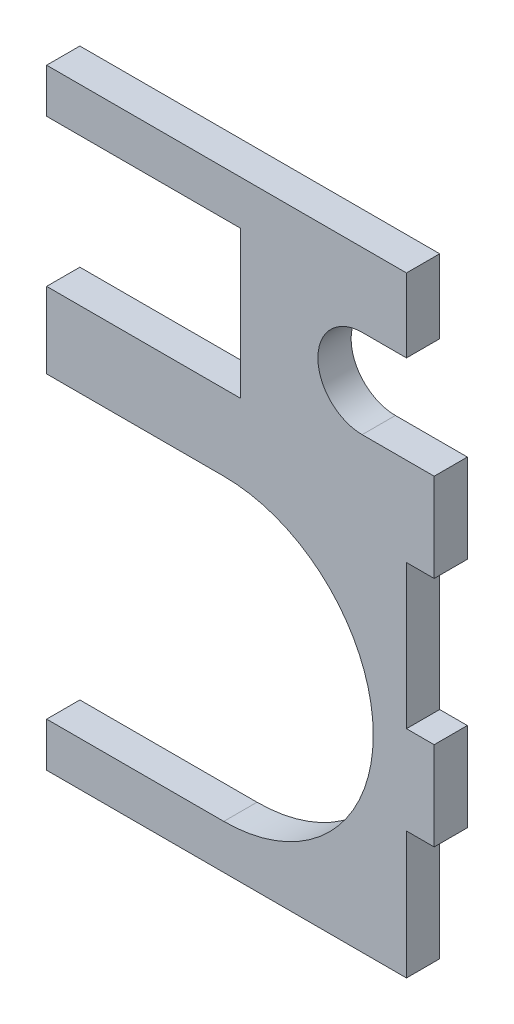
ISO-10303-21;
HEADER;
FILE_DESCRIPTION(('STEP AP214'),'2;1');
FILE_NAME('part.step','',(''),(''),'','','');
FILE_SCHEMA(('AUTOMOTIVE_DESIGN { 1 0 10303 214 1 1 1 1 }'));
ENDSEC;
DATA;
#1=APPLICATION_CONTEXT('core data for automotive mechanical design processes');
#2=APPLICATION_PROTOCOL_DEFINITION('international standard','automotive_design',2000,#1);
#3=PRODUCT_CONTEXT('',#1,'mechanical');
#4=PRODUCT('Part','Part','',(#3));
#5=PRODUCT_RELATED_PRODUCT_CATEGORY('part','',(#4));
#6=PRODUCT_DEFINITION_FORMATION('','',#4);
#7=PRODUCT_DEFINITION_CONTEXT('part definition',#1,'design');
#8=PRODUCT_DEFINITION('design','',#6,#7);
#9=PRODUCT_DEFINITION_SHAPE('','',#8);
#10=(LENGTH_UNIT() NAMED_UNIT(*) SI_UNIT(.MILLI.,.METRE.));
#11=(NAMED_UNIT(*) PLANE_ANGLE_UNIT() SI_UNIT($,.RADIAN.));
#12=(NAMED_UNIT(*) SI_UNIT($,.STERADIAN.) SOLID_ANGLE_UNIT());
#13=UNCERTAINTY_MEASURE_WITH_UNIT(LENGTH_MEASURE(1.E-05),#10,'distance_accuracy_value','');
#14=(GEOMETRIC_REPRESENTATION_CONTEXT(3) GLOBAL_UNCERTAINTY_ASSIGNED_CONTEXT((#13)) GLOBAL_UNIT_ASSIGNED_CONTEXT((#10,
#11,#12)) REPRESENTATION_CONTEXT('',''));
#15=CARTESIAN_POINT('',(0.,0.,0.));
#16=DIRECTION('',(0.,0.,1.));
#17=DIRECTION('',(1.,0.,0.));
#18=AXIS2_PLACEMENT_3D('',#15,#16,#17);
#19=CARTESIAN_POINT('',(12.5,26.9999999999999,3.));
#20=DIRECTION('',(0.,0.,-1.));
#21=DIRECTION('',(-1.,0.,0.));
#22=AXIS2_PLACEMENT_3D('',#19,#20,#21);
#23=CYLINDRICAL_SURFACE('',#22,4.);
#24=CARTESIAN_POINT('',(12.5,26.9999999999999,0.));
#25=DIRECTION('',(0.,0.,-1.));
#26=DIRECTION('',(1.,0.,0.));
#27=AXIS2_PLACEMENT_3D('',#24,#25,#26);
#28=CIRCLE('',#27,4.);
#29=CARTESIAN_POINT('',(12.5,22.9999999999999,0.));
#30=VERTEX_POINT('',#29);
#31=CARTESIAN_POINT('',(12.5,30.9999999999999,0.));
#32=VERTEX_POINT('',#31);
#33=EDGE_CURVE('E213',#30,#32,#28,.T.);
#34=ORIENTED_EDGE('',*,*,#33,.T.);
#35=DIRECTION('',(0.,0.,-1.));
#36=VECTOR('',#35,1.);
#37=CARTESIAN_POINT('',(12.5,30.9999999999999,3.));
#38=LINE('',#37,#36);
#39=CARTESIAN_POINT('',(12.5,30.9999999999999,3.));
#40=VERTEX_POINT('',#39);
#41=EDGE_CURVE('E11',#40,#32,#38,.T.);
#42=ORIENTED_EDGE('',*,*,#41,.F.);
#43=CARTESIAN_POINT('',(12.5,26.9999999999999,3.));
#44=DIRECTION('',(0.,0.,-1.));
#45=DIRECTION('',(1.,0.,0.));
#46=AXIS2_PLACEMENT_3D('',#43,#44,#45);
#47=CIRCLE('',#46,4.);
#48=CARTESIAN_POINT('',(12.5,22.9999999999999,3.));
#49=VERTEX_POINT('',#48);
#50=EDGE_CURVE('E255',#49,#40,#47,.T.);
#51=ORIENTED_EDGE('',*,*,#50,.F.);
#52=DIRECTION('',(0.,0.,-1.));
#53=VECTOR('',#52,1.);
#54=CARTESIAN_POINT('',(12.5,22.9999999999999,3.));
#55=LINE('',#54,#53);
#56=EDGE_CURVE('E209',#49,#30,#55,.T.);
#57=ORIENTED_EDGE('',*,*,#56,.T.);
#58=EDGE_LOOP('',(#34,#42,#51,#57));
#59=FACE_BOUND('',#58,.T.);
#60=ADVANCED_FACE('F33',(#59),#23,.F.);
#61=CARTESIAN_POINT('',(12.5,30.9999999999999,3.));
#62=DIRECTION('',(0.,1.,0.));
#63=DIRECTION('',(0.,0.,1.));
#64=AXIS2_PLACEMENT_3D('',#61,#62,#63);
#65=PLANE('',#64);
#66=DIRECTION('',(1.,0.,0.));
#67=VECTOR('',#66,1.);
#68=CARTESIAN_POINT('',(12.5,30.9999999999999,0.));
#69=LINE('',#68,#67);
#70=CARTESIAN_POINT('',(16.5,30.9999999999999,0.));
#71=VERTEX_POINT('',#70);
#72=EDGE_CURVE('E216',#32,#71,#69,.T.);
#73=ORIENTED_EDGE('',*,*,#72,.T.);
#74=DIRECTION('',(0.,0.,-1.));
#75=VECTOR('',#74,1.);
#76=CARTESIAN_POINT('',(16.5,30.9999999999999,3.));
#77=LINE('',#76,#75);
#78=CARTESIAN_POINT('',(16.5,30.9999999999999,3.));
#79=VERTEX_POINT('',#78);
#80=EDGE_CURVE('E41',#79,#71,#77,.T.);
#81=ORIENTED_EDGE('',*,*,#80,.F.);
#82=DIRECTION('',(1.,0.,0.));
#83=VECTOR('',#82,1.);
#84=CARTESIAN_POINT('',(12.5,30.9999999999999,3.));
#85=LINE('',#84,#83);
#86=EDGE_CURVE('E134',#40,#79,#85,.T.);
#87=ORIENTED_EDGE('',*,*,#86,.F.);
#88=ORIENTED_EDGE('',*,*,#41,.T.);
#89=EDGE_LOOP('',(#73,#81,#87,#88));
#90=FACE_BOUND('',#89,.T.);
#91=ADVANCED_FACE('F383',(#90),#65,.F.);
#92=CARTESIAN_POINT('',(16.5,30.9999999999999,3.));
#93=DIRECTION('',(-1.,0.,0.));
#94=DIRECTION('',(0.,-1.,0.));
#95=AXIS2_PLACEMENT_3D('',#92,#93,#94);
#96=PLANE('',#95);
#97=DIRECTION('',(0.,1.,0.));
#98=VECTOR('',#97,1.);
#99=CARTESIAN_POINT('',(16.5,30.9999999999999,0.));
#100=LINE('',#99,#98);
#101=CARTESIAN_POINT('',(16.5,37.6499999999998,0.));
#102=VERTEX_POINT('',#101);
#103=EDGE_CURVE('E218',#71,#102,#100,.T.);
#104=ORIENTED_EDGE('',*,*,#103,.T.);
#105=DIRECTION('',(0.,0.,-1.));
#106=VECTOR('',#105,1.);
#107=CARTESIAN_POINT('',(16.5,37.6499999999998,3.));
#108=LINE('',#107,#106);
#109=CARTESIAN_POINT('',(16.5,37.6499999999998,3.));
#110=VERTEX_POINT('',#109);
#111=EDGE_CURVE('E304',#110,#102,#108,.T.);
#112=ORIENTED_EDGE('',*,*,#111,.F.);
#113=DIRECTION('',(0.,1.,0.));
#114=VECTOR('',#113,1.);
#115=CARTESIAN_POINT('',(16.5,30.9999999999999,3.));
#116=LINE('',#115,#114);
#117=EDGE_CURVE('E312',#79,#110,#116,.T.);
#118=ORIENTED_EDGE('',*,*,#117,.F.);
#119=ORIENTED_EDGE('',*,*,#80,.T.);
#120=EDGE_LOOP('',(#104,#112,#118,#119));
#121=FACE_BOUND('',#120,.T.);
#122=ADVANCED_FACE('F310',(#121),#96,.F.);
#123=CARTESIAN_POINT('',(16.5,37.6499999999998,3.));
#124=DIRECTION('',(0.,-1.,0.));
#125=DIRECTION('',(1.,0.,0.));
#126=AXIS2_PLACEMENT_3D('',#123,#124,#125);
#127=PLANE('',#126);
#128=DIRECTION('',(-1.,0.,0.));
#129=VECTOR('',#128,1.);
#130=CARTESIAN_POINT('',(16.5,37.6499999999998,0.));
#131=LINE('',#130,#129);
#132=CARTESIAN_POINT('',(-16.,37.6499999999998,0.));
#133=VERTEX_POINT('',#132);
#134=EDGE_CURVE('E220',#102,#133,#131,.T.);
#135=ORIENTED_EDGE('',*,*,#134,.T.);
#136=DIRECTION('',(0.,0.,-1.));
#137=VECTOR('',#136,1.);
#138=CARTESIAN_POINT('',(-16.,37.6499999999998,3.));
#139=LINE('',#138,#137);
#140=CARTESIAN_POINT('',(-16.,37.6499999999998,3.));
#141=VERTEX_POINT('',#140);
#142=EDGE_CURVE('E301',#141,#133,#139,.T.);
#143=ORIENTED_EDGE('',*,*,#142,.F.);
#144=DIRECTION('',(-1.,0.,0.));
#145=VECTOR('',#144,1.);
#146=CARTESIAN_POINT('',(16.5,37.6499999999998,3.));
#147=LINE('',#146,#145);
#148=EDGE_CURVE('E330',#110,#141,#147,.T.);
#149=ORIENTED_EDGE('',*,*,#148,.F.);
#150=ORIENTED_EDGE('',*,*,#111,.T.);
#151=EDGE_LOOP('',(#135,#143,#149,#150));
#152=FACE_BOUND('',#151,.T.);
#153=ADVANCED_FACE('F321',(#152),#127,.F.);
#154=CARTESIAN_POINT('',(-16.,33.6499999999998,3.));
#155=DIRECTION('',(1.,0.,0.));
#156=DIRECTION('',(0.,1.,0.));
#157=AXIS2_PLACEMENT_3D('',#154,#155,#156);
#158=PLANE('',#157);
#159=DIRECTION('',(0.,-1.,0.));
#160=VECTOR('',#159,1.);
#161=CARTESIAN_POINT('',(-16.,33.6499999999998,0.));
#162=LINE('',#161,#160);
#163=CARTESIAN_POINT('',(-16.,33.6499999999998,0.));
#164=VERTEX_POINT('',#163);
#165=EDGE_CURVE('E222',#133,#164,#162,.T.);
#166=ORIENTED_EDGE('',*,*,#165,.T.);
#167=DIRECTION('',(0.,0.,-1.));
#168=VECTOR('',#167,1.);
#169=CARTESIAN_POINT('',(-16.,33.6499999999998,3.));
#170=LINE('',#169,#168);
#171=CARTESIAN_POINT('',(-16.,33.6499999999998,3.));
#172=VERTEX_POINT('',#171);
#173=EDGE_CURVE('E298',#172,#164,#170,.T.);
#174=ORIENTED_EDGE('',*,*,#173,.F.);
#175=DIRECTION('',(0.,-1.,0.));
#176=VECTOR('',#175,1.);
#177=CARTESIAN_POINT('',(-16.,33.6499999999998,3.));
#178=LINE('',#177,#176);
#179=EDGE_CURVE('E327',#141,#172,#178,.T.);
#180=ORIENTED_EDGE('',*,*,#179,.F.);
#181=ORIENTED_EDGE('',*,*,#142,.T.);
#182=EDGE_LOOP('',(#166,#174,#180,#181));
#183=FACE_BOUND('',#182,.T.);
#184=ADVANCED_FACE('F325',(#183),#158,.F.);
#185=CARTESIAN_POINT('',(-16.,33.6499999999998,3.));
#186=DIRECTION('',(0.,1.,0.));
#187=DIRECTION('',(0.,0.,1.));
#188=AXIS2_PLACEMENT_3D('',#185,#186,#187);
#189=PLANE('',#188);
#190=DIRECTION('',(1.,0.,0.));
#191=VECTOR('',#190,1.);
#192=CARTESIAN_POINT('',(-16.,33.6499999999998,0.));
#193=LINE('',#192,#191);
#194=CARTESIAN_POINT('',(1.50000000000321,33.6499999999998,0.));
#195=VERTEX_POINT('',#194);
#196=EDGE_CURVE('E224',#164,#195,#193,.T.);
#197=ORIENTED_EDGE('',*,*,#196,.T.);
#198=DIRECTION('',(0.,0.,-1.));
#199=VECTOR('',#198,1.);
#200=CARTESIAN_POINT('',(1.50000000000321,33.6499999999998,3.));
#201=LINE('',#200,#199);
#202=CARTESIAN_POINT('',(1.50000000000321,33.6499999999998,3.));
#203=VERTEX_POINT('',#202);
#204=EDGE_CURVE('E295',#203,#195,#201,.T.);
#205=ORIENTED_EDGE('',*,*,#204,.F.);
#206=DIRECTION('',(1.,0.,0.));
#207=VECTOR('',#206,1.);
#208=CARTESIAN_POINT('',(-16.,33.6499999999998,3.));
#209=LINE('',#208,#207);
#210=EDGE_CURVE('E329',#172,#203,#209,.T.);
#211=ORIENTED_EDGE('',*,*,#210,.F.);
#212=ORIENTED_EDGE('',*,*,#173,.T.);
#213=EDGE_LOOP('',(#197,#205,#211,#212));
#214=FACE_BOUND('',#213,.T.);
#215=ADVANCED_FACE('F396',(#214),#189,.F.);
#216=CARTESIAN_POINT('',(1.50000000000321,33.6499999999998,3.));
#217=DIRECTION('',(1.,0.,0.));
#218=DIRECTION('',(0.,1.,0.));
#219=AXIS2_PLACEMENT_3D('',#216,#217,#218);
#220=PLANE('',#219);
#221=DIRECTION('',(0.,-1.,0.));
#222=VECTOR('',#221,1.);
#223=CARTESIAN_POINT('',(1.50000000000321,33.6499999999998,0.));
#224=LINE('',#223,#222);
#225=CARTESIAN_POINT('',(1.50000000000322,20.35,0.));
#226=VERTEX_POINT('',#225);
#227=EDGE_CURVE('E226',#195,#226,#224,.T.);
#228=ORIENTED_EDGE('',*,*,#227,.T.);
#229=DIRECTION('',(0.,0.,-1.));
#230=VECTOR('',#229,1.);
#231=CARTESIAN_POINT('',(1.50000000000322,20.35,3.));
#232=LINE('',#231,#230);
#233=CARTESIAN_POINT('',(1.50000000000322,20.35,3.));
#234=VERTEX_POINT('',#233);
#235=EDGE_CURVE('E292',#234,#226,#232,.T.);
#236=ORIENTED_EDGE('',*,*,#235,.F.);
#237=DIRECTION('',(0.,-1.,0.));
#238=VECTOR('',#237,1.);
#239=CARTESIAN_POINT('',(1.50000000000321,33.6499999999998,3.));
#240=LINE('',#239,#238);
#241=EDGE_CURVE('E332',#203,#234,#240,.T.);
#242=ORIENTED_EDGE('',*,*,#241,.F.);
#243=ORIENTED_EDGE('',*,*,#204,.T.);
#244=EDGE_LOOP('',(#228,#236,#242,#243));
#245=FACE_BOUND('',#244,.T.);
#246=ADVANCED_FACE('F399',(#245),#220,.F.);
#247=CARTESIAN_POINT('',(1.50000000000322,20.35,3.));
#248=DIRECTION('',(0.,-1.,0.));
#249=DIRECTION('',(1.,0.,0.));
#250=AXIS2_PLACEMENT_3D('',#247,#248,#249);
#251=PLANE('',#250);
#252=DIRECTION('',(-1.,0.,0.));
#253=VECTOR('',#252,1.);
#254=CARTESIAN_POINT('',(1.50000000000322,20.35,0.));
#255=LINE('',#254,#253);
#256=CARTESIAN_POINT('',(-15.9999999999999,20.35,0.));
#257=VERTEX_POINT('',#256);
#258=EDGE_CURVE('E228',#226,#257,#255,.T.);
#259=ORIENTED_EDGE('',*,*,#258,.T.);
#260=DIRECTION('',(0.,0.,-1.));
#261=VECTOR('',#260,1.);
#262=CARTESIAN_POINT('',(-15.9999999999999,20.35,3.));
#263=LINE('',#262,#261);
#264=CARTESIAN_POINT('',(-15.9999999999999,20.35,3.));
#265=VERTEX_POINT('',#264);
#266=EDGE_CURVE('E289',#265,#257,#263,.T.);
#267=ORIENTED_EDGE('',*,*,#266,.F.);
#268=DIRECTION('',(-1.,0.,0.));
#269=VECTOR('',#268,1.);
#270=CARTESIAN_POINT('',(1.50000000000322,20.35,3.));
#271=LINE('',#270,#269);
#272=EDGE_CURVE('E338',#234,#265,#271,.T.);
#273=ORIENTED_EDGE('',*,*,#272,.F.);
#274=ORIENTED_EDGE('',*,*,#235,.T.);
#275=EDGE_LOOP('',(#259,#267,#273,#274));
#276=FACE_BOUND('',#275,.T.);
#277=ADVANCED_FACE('F403',(#276),#251,.F.);
#278=CARTESIAN_POINT('',(-15.9999999999999,13.5000000000001,3.));
#279=DIRECTION('',(1.,0.,0.));
#280=DIRECTION('',(0.,1.,0.));
#281=AXIS2_PLACEMENT_3D('',#278,#279,#280);
#282=PLANE('',#281);
#283=DIRECTION('',(0.,-1.,0.));
#284=VECTOR('',#283,1.);
#285=CARTESIAN_POINT('',(-15.9999999999999,13.5000000000001,0.));
#286=LINE('',#285,#284);
#287=CARTESIAN_POINT('',(-15.9999999999999,13.5000000000001,0.));
#288=VERTEX_POINT('',#287);
#289=EDGE_CURVE('E230',#257,#288,#286,.T.);
#290=ORIENTED_EDGE('',*,*,#289,.T.);
#291=DIRECTION('',(0.,0.,-1.));
#292=VECTOR('',#291,1.);
#293=CARTESIAN_POINT('',(-15.9999999999999,13.5000000000001,3.));
#294=LINE('',#293,#292);
#295=CARTESIAN_POINT('',(-15.9999999999999,13.5000000000001,3.));
#296=VERTEX_POINT('',#295);
#297=EDGE_CURVE('E286',#296,#288,#294,.T.);
#298=ORIENTED_EDGE('',*,*,#297,.F.);
#299=DIRECTION('',(0.,-1.,0.));
#300=VECTOR('',#299,1.);
#301=CARTESIAN_POINT('',(-15.9999999999999,13.5000000000001,3.));
#302=LINE('',#301,#300);
#303=EDGE_CURVE('E340',#265,#296,#302,.T.);
#304=ORIENTED_EDGE('',*,*,#303,.F.);
#305=ORIENTED_EDGE('',*,*,#266,.T.);
#306=EDGE_LOOP('',(#290,#298,#304,#305));
#307=FACE_BOUND('',#306,.T.);
#308=ADVANCED_FACE('F407',(#307),#282,.F.);
#309=CARTESIAN_POINT('',(0.,13.5000000000001,3.));
#310=DIRECTION('',(0.,1.,0.));
#311=DIRECTION('',(-1.,0.,0.));
#312=AXIS2_PLACEMENT_3D('',#309,#310,#311);
#313=PLANE('',#312);
#314=DIRECTION('',(1.,0.,0.));
#315=VECTOR('',#314,1.);
#316=CARTESIAN_POINT('',(0.,13.5000000000001,0.));
#317=LINE('',#316,#315);
#318=CARTESIAN_POINT('',(0.,13.5000000000001,0.));
#319=VERTEX_POINT('',#318);
#320=EDGE_CURVE('E232',#288,#319,#317,.T.);
#321=ORIENTED_EDGE('',*,*,#320,.T.);
#322=DIRECTION('',(0.,0.,-1.));
#323=VECTOR('',#322,1.);
#324=CARTESIAN_POINT('',(0.,13.5000000000001,3.));
#325=LINE('',#324,#323);
#326=CARTESIAN_POINT('',(0.,13.5000000000001,3.));
#327=VERTEX_POINT('',#326);
#328=EDGE_CURVE('E283',#327,#319,#325,.T.);
#329=ORIENTED_EDGE('',*,*,#328,.F.);
#330=DIRECTION('',(1.,0.,0.));
#331=VECTOR('',#330,1.);
#332=CARTESIAN_POINT('',(0.,13.5000000000001,3.));
#333=LINE('',#332,#331);
#334=EDGE_CURVE('E342',#296,#327,#333,.T.);
#335=ORIENTED_EDGE('',*,*,#334,.F.);
#336=ORIENTED_EDGE('',*,*,#297,.T.);
#337=EDGE_LOOP('',(#321,#329,#335,#336));
#338=FACE_BOUND('',#337,.T.);
#339=ADVANCED_FACE('F411',(#338),#313,.F.);
#340=CARTESIAN_POINT('',(0.,0.,3.));
#341=DIRECTION('',(0.,0.,-1.));
#342=DIRECTION('',(-1.,0.,0.));
#343=AXIS2_PLACEMENT_3D('',#340,#341,#342);
#344=CYLINDRICAL_SURFACE('',#343,13.5000000000001);
#345=CARTESIAN_POINT('',(0.,0.,0.));
#346=DIRECTION('',(0.,0.,-1.));
#347=DIRECTION('',(1.,0.,0.));
#348=AXIS2_PLACEMENT_3D('',#345,#346,#347);
#349=CIRCLE('',#348,13.5000000000001);
#350=CARTESIAN_POINT('',(0.,-13.5000000000001,0.));
#351=VERTEX_POINT('',#350);
#352=EDGE_CURVE('E234',#319,#351,#349,.T.);
#353=ORIENTED_EDGE('',*,*,#352,.T.);
#354=DIRECTION('',(0.,0.,-1.));
#355=VECTOR('',#354,1.);
#356=CARTESIAN_POINT('',(0.,-13.5000000000001,3.));
#357=LINE('',#356,#355);
#358=CARTESIAN_POINT('',(0.,-13.5000000000001,3.));
#359=VERTEX_POINT('',#358);
#360=EDGE_CURVE('E280',#359,#351,#357,.T.);
#361=ORIENTED_EDGE('',*,*,#360,.F.);
#362=CARTESIAN_POINT('',(0.,0.,3.));
#363=DIRECTION('',(0.,0.,-1.));
#364=DIRECTION('',(1.,0.,0.));
#365=AXIS2_PLACEMENT_3D('',#362,#363,#364);
#366=CIRCLE('',#365,13.5000000000001);
#367=EDGE_CURVE('E344',#327,#359,#366,.T.);
#368=ORIENTED_EDGE('',*,*,#367,.F.);
#369=ORIENTED_EDGE('',*,*,#328,.T.);
#370=EDGE_LOOP('',(#353,#361,#368,#369));
#371=FACE_BOUND('',#370,.T.);
#372=ADVANCED_FACE('F415',(#371),#344,.F.);
#373=CARTESIAN_POINT('',(-15.9999999999999,-13.5000000000001,3.));
#374=DIRECTION('',(0.,-1.,0.));
#375=DIRECTION('',(0.,0.,-1.));
#376=AXIS2_PLACEMENT_3D('',#373,#374,#375);
#377=PLANE('',#376);
#378=DIRECTION('',(-1.,0.,0.));
#379=VECTOR('',#378,1.);
#380=CARTESIAN_POINT('',(-15.9999999999999,-13.5000000000001,0.));
#381=LINE('',#380,#379);
#382=CARTESIAN_POINT('',(-15.9999999999999,-13.5000000000001,0.));
#383=VERTEX_POINT('',#382);
#384=EDGE_CURVE('E236',#351,#383,#381,.T.);
#385=ORIENTED_EDGE('',*,*,#384,.T.);
#386=DIRECTION('',(0.,0.,-1.));
#387=VECTOR('',#386,1.);
#388=CARTESIAN_POINT('',(-15.9999999999999,-13.5000000000001,3.));
#389=LINE('',#388,#387);
#390=CARTESIAN_POINT('',(-15.9999999999999,-13.5000000000001,3.));
#391=VERTEX_POINT('',#390);
#392=EDGE_CURVE('E277',#391,#383,#389,.T.);
#393=ORIENTED_EDGE('',*,*,#392,.F.);
#394=DIRECTION('',(-1.,0.,0.));
#395=VECTOR('',#394,1.);
#396=CARTESIAN_POINT('',(-15.9999999999999,-13.5000000000001,3.));
#397=LINE('',#396,#395);
#398=EDGE_CURVE('E346',#359,#391,#397,.T.);
#399=ORIENTED_EDGE('',*,*,#398,.F.);
#400=ORIENTED_EDGE('',*,*,#360,.T.);
#401=EDGE_LOOP('',(#385,#393,#399,#400));
#402=FACE_BOUND('',#401,.T.);
#403=ADVANCED_FACE('F419',(#402),#377,.F.);
#404=CARTESIAN_POINT('',(-15.9999999999999,-17.5,3.));
#405=DIRECTION('',(1.,0.,0.));
#406=DIRECTION('',(0.,0.,-1.));
#407=AXIS2_PLACEMENT_3D('',#404,#405,#406);
#408=PLANE('',#407);
#409=DIRECTION('',(0.,-1.,0.));
#410=VECTOR('',#409,1.);
#411=CARTESIAN_POINT('',(-15.9999999999999,-17.5,0.));
#412=LINE('',#411,#410);
#413=CARTESIAN_POINT('',(-15.9999999999999,-17.5,0.));
#414=VERTEX_POINT('',#413);
#415=EDGE_CURVE('E238',#383,#414,#412,.T.);
#416=ORIENTED_EDGE('',*,*,#415,.T.);
#417=DIRECTION('',(0.,0.,-1.));
#418=VECTOR('',#417,1.);
#419=CARTESIAN_POINT('',(-15.9999999999999,-17.5,3.));
#420=LINE('',#419,#418);
#421=CARTESIAN_POINT('',(-15.9999999999999,-17.5,3.));
#422=VERTEX_POINT('',#421);
#423=EDGE_CURVE('E274',#422,#414,#420,.T.);
#424=ORIENTED_EDGE('',*,*,#423,.F.);
#425=DIRECTION('',(0.,-1.,0.));
#426=VECTOR('',#425,1.);
#427=CARTESIAN_POINT('',(-15.9999999999999,-17.5,3.));
#428=LINE('',#427,#426);
#429=EDGE_CURVE('E348',#391,#422,#428,.T.);
#430=ORIENTED_EDGE('',*,*,#429,.F.);
#431=ORIENTED_EDGE('',*,*,#392,.T.);
#432=EDGE_LOOP('',(#416,#424,#430,#431));
#433=FACE_BOUND('',#432,.T.);
#434=ADVANCED_FACE('F423',(#433),#408,.F.);
#435=CARTESIAN_POINT('',(-15.9999999999999,-17.5,3.));
#436=DIRECTION('',(0.,1.,0.));
#437=DIRECTION('',(0.,0.,1.));
#438=AXIS2_PLACEMENT_3D('',#435,#436,#437);
#439=PLANE('',#438);
#440=DIRECTION('',(1.,0.,0.));
#441=VECTOR('',#440,1.);
#442=CARTESIAN_POINT('',(-15.9999999999999,-17.5,0.));
#443=LINE('',#442,#441);
#444=CARTESIAN_POINT('',(16.5,-17.5,0.));
#445=VERTEX_POINT('',#444);
#446=EDGE_CURVE('E240',#414,#445,#443,.T.);
#447=ORIENTED_EDGE('',*,*,#446,.T.);
#448=DIRECTION('',(0.,0.,-1.));
#449=VECTOR('',#448,1.);
#450=CARTESIAN_POINT('',(16.5,-17.5,3.));
#451=LINE('',#450,#449);
#452=CARTESIAN_POINT('',(16.5,-17.5,3.));
#453=VERTEX_POINT('',#452);
#454=EDGE_CURVE('E271',#453,#445,#451,.T.);
#455=ORIENTED_EDGE('',*,*,#454,.F.);
#456=DIRECTION('',(1.,0.,0.));
#457=VECTOR('',#456,1.);
#458=CARTESIAN_POINT('',(-15.9999999999999,-17.5,3.));
#459=LINE('',#458,#457);
#460=EDGE_CURVE('E350',#422,#453,#459,.T.);
#461=ORIENTED_EDGE('',*,*,#460,.F.);
#462=ORIENTED_EDGE('',*,*,#423,.T.);
#463=EDGE_LOOP('',(#447,#455,#461,#462));
#464=FACE_BOUND('',#463,.T.);
#465=ADVANCED_FACE('F427',(#464),#439,.F.);
#466=CARTESIAN_POINT('',(16.5,-17.5,3.));
#467=DIRECTION('',(-1.,0.,0.));
#468=DIRECTION('',(0.,-1.,0.));
#469=AXIS2_PLACEMENT_3D('',#466,#467,#468);
#470=PLANE('',#469);
#471=DIRECTION('',(0.,1.,0.));
#472=VECTOR('',#471,1.);
#473=CARTESIAN_POINT('',(16.5,-17.5,0.));
#474=LINE('',#473,#472);
#475=CARTESIAN_POINT('',(16.5,-6.00000000000001,0.));
#476=VERTEX_POINT('',#475);
#477=EDGE_CURVE('E242',#445,#476,#474,.T.);
#478=ORIENTED_EDGE('',*,*,#477,.T.);
#479=DIRECTION('',(0.,0.,-1.));
#480=VECTOR('',#479,1.);
#481=CARTESIAN_POINT('',(16.5,-6.00000000000001,3.));
#482=LINE('',#481,#480);
#483=CARTESIAN_POINT('',(16.5,-6.00000000000001,3.));
#484=VERTEX_POINT('',#483);
#485=EDGE_CURVE('E268',#484,#476,#482,.T.);
#486=ORIENTED_EDGE('',*,*,#485,.F.);
#487=DIRECTION('',(0.,1.,0.));
#488=VECTOR('',#487,1.);
#489=CARTESIAN_POINT('',(16.5,-17.5,3.));
#490=LINE('',#489,#488);
#491=EDGE_CURVE('E352',#453,#484,#490,.T.);
#492=ORIENTED_EDGE('',*,*,#491,.F.);
#493=ORIENTED_EDGE('',*,*,#454,.T.);
#494=EDGE_LOOP('',(#478,#486,#492,#493));
#495=FACE_BOUND('',#494,.T.);
#496=ADVANCED_FACE('F431',(#495),#470,.F.);
#497=CARTESIAN_POINT('',(19.0000000000031,-6.,3.));
#498=DIRECTION('',(0.,1.,0.));
#499=DIRECTION('',(-1.,0.,0.));
#500=AXIS2_PLACEMENT_3D('',#497,#498,#499);
#501=PLANE('',#500);
#502=DIRECTION('',(1.,0.,0.));
#503=VECTOR('',#502,1.);
#504=CARTESIAN_POINT('',(19.0000000000031,-6.,0.));
#505=LINE('',#504,#503);
#506=CARTESIAN_POINT('',(19.0000000000031,-6.,0.));
#507=VERTEX_POINT('',#506);
#508=EDGE_CURVE('E244',#476,#507,#505,.T.);
#509=ORIENTED_EDGE('',*,*,#508,.T.);
#510=DIRECTION('',(0.,0.,-1.));
#511=VECTOR('',#510,1.);
#512=CARTESIAN_POINT('',(19.0000000000031,-6.,3.));
#513=LINE('',#512,#511);
#514=CARTESIAN_POINT('',(19.0000000000031,-6.,3.));
#515=VERTEX_POINT('',#514);
#516=EDGE_CURVE('E265',#515,#507,#513,.T.);
#517=ORIENTED_EDGE('',*,*,#516,.F.);
#518=DIRECTION('',(1.,0.,0.));
#519=VECTOR('',#518,1.);
#520=CARTESIAN_POINT('',(19.0000000000031,-6.,3.));
#521=LINE('',#520,#519);
#522=EDGE_CURVE('E354',#484,#515,#521,.T.);
#523=ORIENTED_EDGE('',*,*,#522,.F.);
#524=ORIENTED_EDGE('',*,*,#485,.T.);
#525=EDGE_LOOP('',(#509,#517,#523,#524));
#526=FACE_BOUND('',#525,.T.);
#527=ADVANCED_FACE('F435',(#526),#501,.F.);
#528=CARTESIAN_POINT('',(19.0000000000031,2.,3.));
#529=DIRECTION('',(-1.,0.,0.));
#530=DIRECTION('',(0.,0.,1.));
#531=AXIS2_PLACEMENT_3D('',#528,#529,#530);
#532=PLANE('',#531);
#533=DIRECTION('',(0.,1.,0.));
#534=VECTOR('',#533,1.);
#535=CARTESIAN_POINT('',(19.0000000000031,2.,0.));
#536=LINE('',#535,#534);
#537=CARTESIAN_POINT('',(19.0000000000031,2.,0.));
#538=VERTEX_POINT('',#537);
#539=EDGE_CURVE('E246',#507,#538,#536,.T.);
#540=ORIENTED_EDGE('',*,*,#539,.T.);
#541=DIRECTION('',(0.,0.,-1.));
#542=VECTOR('',#541,1.);
#543=CARTESIAN_POINT('',(19.0000000000031,2.,3.));
#544=LINE('',#543,#542);
#545=CARTESIAN_POINT('',(19.0000000000031,2.,3.));
#546=VERTEX_POINT('',#545);
#547=EDGE_CURVE('E262',#546,#538,#544,.T.);
#548=ORIENTED_EDGE('',*,*,#547,.F.);
#549=DIRECTION('',(0.,1.,0.));
#550=VECTOR('',#549,1.);
#551=CARTESIAN_POINT('',(19.0000000000031,2.,3.));
#552=LINE('',#551,#550);
#553=EDGE_CURVE('E356',#515,#546,#552,.T.);
#554=ORIENTED_EDGE('',*,*,#553,.F.);
#555=ORIENTED_EDGE('',*,*,#516,.T.);
#556=EDGE_LOOP('',(#540,#548,#554,#555));
#557=FACE_BOUND('',#556,.T.);
#558=ADVANCED_FACE('F439',(#557),#532,.F.);
#559=CARTESIAN_POINT('',(19.0000000000031,2.,3.));
#560=DIRECTION('',(0.,-1.,0.));
#561=DIRECTION('',(0.,0.,-1.));
#562=AXIS2_PLACEMENT_3D('',#559,#560,#561);
#563=PLANE('',#562);
#564=DIRECTION('',(-1.,0.,0.));
#565=VECTOR('',#564,1.);
#566=CARTESIAN_POINT('',(19.0000000000031,2.,0.));
#567=LINE('',#566,#565);
#568=CARTESIAN_POINT('',(16.5,2.,0.));
#569=VERTEX_POINT('',#568);
#570=EDGE_CURVE('E248',#538,#569,#567,.T.);
#571=ORIENTED_EDGE('',*,*,#570,.T.);
#572=DIRECTION('',(0.,0.,-1.));
#573=VECTOR('',#572,1.);
#574=CARTESIAN_POINT('',(16.5,2.,3.));
#575=LINE('',#574,#573);
#576=CARTESIAN_POINT('',(16.5,2.,3.));
#577=VERTEX_POINT('',#576);
#578=EDGE_CURVE('E259',#577,#569,#575,.T.);
#579=ORIENTED_EDGE('',*,*,#578,.F.);
#580=DIRECTION('',(-1.,0.,0.));
#581=VECTOR('',#580,1.);
#582=CARTESIAN_POINT('',(19.0000000000031,2.,3.));
#583=LINE('',#582,#581);
#584=EDGE_CURVE('E358',#546,#577,#583,.T.);
#585=ORIENTED_EDGE('',*,*,#584,.F.);
#586=ORIENTED_EDGE('',*,*,#547,.T.);
#587=EDGE_LOOP('',(#571,#579,#585,#586));
#588=FACE_BOUND('',#587,.T.);
#589=ADVANCED_FACE('F364',(#588),#563,.F.);
#590=CARTESIAN_POINT('',(16.5,2.,3.));
#591=DIRECTION('',(-1.,0.,0.));
#592=DIRECTION('',(0.,-1.,0.));
#593=AXIS2_PLACEMENT_3D('',#590,#591,#592);
#594=PLANE('',#593);
#595=DIRECTION('',(0.,1.,0.));
#596=VECTOR('',#595,1.);
#597=CARTESIAN_POINT('',(16.5,2.,0.));
#598=LINE('',#597,#596);
#599=CARTESIAN_POINT('',(16.5,14.9999999999998,0.));
#600=VERTEX_POINT('',#599);
#601=EDGE_CURVE('E250',#569,#600,#598,.T.);
#602=ORIENTED_EDGE('',*,*,#601,.T.);
#603=DIRECTION('',(0.,0.,-1.));
#604=VECTOR('',#603,1.);
#605=CARTESIAN_POINT('',(16.5,14.9999999999998,3.));
#606=LINE('',#605,#604);
#607=CARTESIAN_POINT('',(16.5,14.9999999999998,3.));
#608=VERTEX_POINT('',#607);
#609=EDGE_CURVE('E204',#608,#600,#606,.T.);
#610=ORIENTED_EDGE('',*,*,#609,.F.);
#611=DIRECTION('',(0.,1.,0.));
#612=VECTOR('',#611,1.);
#613=CARTESIAN_POINT('',(16.5,2.,3.));
#614=LINE('',#613,#612);
#615=EDGE_CURVE('E195',#577,#608,#614,.T.);
#616=ORIENTED_EDGE('',*,*,#615,.F.);
#617=ORIENTED_EDGE('',*,*,#578,.T.);
#618=EDGE_LOOP('',(#602,#610,#616,#617));
#619=FACE_BOUND('',#618,.T.);
#620=ADVANCED_FACE('F368',(#619),#594,.F.);
#621=CARTESIAN_POINT('',(19.0000000000031,14.9999999999998,3.));
#622=DIRECTION('',(0.,1.,0.));
#623=DIRECTION('',(0.,0.,1.));
#624=AXIS2_PLACEMENT_3D('',#621,#622,#623);
#625=PLANE('',#624);
#626=DIRECTION('',(1.,0.,0.));
#627=VECTOR('',#626,1.);
#628=CARTESIAN_POINT('',(19.0000000000031,14.9999999999998,0.));
#629=LINE('',#628,#627);
#630=CARTESIAN_POINT('',(19.0000000000031,14.9999999999998,0.));
#631=VERTEX_POINT('',#630);
#632=EDGE_CURVE('E203',#600,#631,#629,.T.);
#633=ORIENTED_EDGE('',*,*,#632,.T.);
#634=DIRECTION('',(0.,0.,-1.));
#635=VECTOR('',#634,1.);
#636=CARTESIAN_POINT('',(19.0000000000031,14.9999999999998,3.));
#637=LINE('',#636,#635);
#638=CARTESIAN_POINT('',(19.0000000000031,14.9999999999998,3.));
#639=VERTEX_POINT('',#638);
#640=EDGE_CURVE('E200',#639,#631,#637,.T.);
#641=ORIENTED_EDGE('',*,*,#640,.F.);
#642=DIRECTION('',(1.,0.,0.));
#643=VECTOR('',#642,1.);
#644=CARTESIAN_POINT('',(19.0000000000031,14.9999999999998,3.));
#645=LINE('',#644,#643);
#646=EDGE_CURVE('E189',#608,#639,#645,.T.);
#647=ORIENTED_EDGE('',*,*,#646,.F.);
#648=ORIENTED_EDGE('',*,*,#609,.T.);
#649=EDGE_LOOP('',(#633,#641,#647,#648));
#650=FACE_BOUND('',#649,.T.);
#651=ADVANCED_FACE('F201',(#650),#625,.F.);
#652=CARTESIAN_POINT('',(19.0000000000031,22.9999999999999,3.));
#653=DIRECTION('',(-1.,0.,0.));
#654=DIRECTION('',(0.,0.,1.));
#655=AXIS2_PLACEMENT_3D('',#652,#653,#654);
#656=PLANE('',#655);
#657=DIRECTION('',(0.,1.,0.));
#658=VECTOR('',#657,1.);
#659=CARTESIAN_POINT('',(19.0000000000031,22.9999999999999,0.));
#660=LINE('',#659,#658);
#661=CARTESIAN_POINT('',(19.0000000000031,22.9999999999999,0.));
#662=VERTEX_POINT('',#661);
#663=EDGE_CURVE('E120',#631,#662,#660,.T.);
#664=ORIENTED_EDGE('',*,*,#663,.T.);
#665=DIRECTION('',(0.,0.,-1.));
#666=VECTOR('',#665,1.);
#667=CARTESIAN_POINT('',(19.0000000000031,22.9999999999999,3.));
#668=LINE('',#667,#666);
#669=CARTESIAN_POINT('',(19.0000000000031,22.9999999999999,3.));
#670=VERTEX_POINT('',#669);
#671=EDGE_CURVE('E205',#670,#662,#668,.T.);
#672=ORIENTED_EDGE('',*,*,#671,.F.);
#673=DIRECTION('',(0.,1.,0.));
#674=VECTOR('',#673,1.);
#675=CARTESIAN_POINT('',(19.0000000000031,22.9999999999999,3.));
#676=LINE('',#675,#674);
#677=EDGE_CURVE('E193',#639,#670,#676,.T.);
#678=ORIENTED_EDGE('',*,*,#677,.F.);
#679=ORIENTED_EDGE('',*,*,#640,.T.);
#680=EDGE_LOOP('',(#664,#672,#678,#679));
#681=FACE_BOUND('',#680,.T.);
#682=ADVANCED_FACE('F207',(#681),#656,.F.);
#683=CARTESIAN_POINT('',(12.5,22.9999999999999,3.));
#684=DIRECTION('',(0.,-1.,0.));
#685=DIRECTION('',(0.,0.,-1.));
#686=AXIS2_PLACEMENT_3D('',#683,#684,#685);
#687=PLANE('',#686);
#688=DIRECTION('',(-1.,0.,0.));
#689=VECTOR('',#688,1.);
#690=CARTESIAN_POINT('',(12.5,22.9999999999999,0.));
#691=LINE('',#690,#689);
#692=EDGE_CURVE('E126',#662,#30,#691,.T.);
#693=ORIENTED_EDGE('',*,*,#692,.T.);
#694=ORIENTED_EDGE('',*,*,#56,.F.);
#695=DIRECTION('',(-1.,0.,0.));
#696=VECTOR('',#695,1.);
#697=CARTESIAN_POINT('',(12.5,22.9999999999999,3.));
#698=LINE('',#697,#696);
#699=EDGE_CURVE('E49',#670,#49,#698,.T.);
#700=ORIENTED_EDGE('',*,*,#699,.F.);
#701=ORIENTED_EDGE('',*,*,#671,.T.);
#702=EDGE_LOOP('',(#693,#694,#700,#701));
#703=FACE_BOUND('',#702,.T.);
#704=ADVANCED_FACE('F372',(#703),#687,.F.);
#705=CARTESIAN_POINT('',(12.5,26.9999999999999,3.));
#706=DIRECTION('',(0.,0.,1.));
#707=DIRECTION('',(1.,0.,0.));
#708=AXIS2_PLACEMENT_3D('',#705,#706,#707);
#709=PLANE('',#708);
#710=ORIENTED_EDGE('',*,*,#50,.T.);
#711=ORIENTED_EDGE('',*,*,#86,.T.);
#712=ORIENTED_EDGE('',*,*,#117,.T.);
#713=ORIENTED_EDGE('',*,*,#148,.T.);
#714=ORIENTED_EDGE('',*,*,#179,.T.);
#715=ORIENTED_EDGE('',*,*,#210,.T.);
#716=ORIENTED_EDGE('',*,*,#241,.T.);
#717=ORIENTED_EDGE('',*,*,#272,.T.);
#718=ORIENTED_EDGE('',*,*,#303,.T.);
#719=ORIENTED_EDGE('',*,*,#334,.T.);
#720=ORIENTED_EDGE('',*,*,#367,.T.);
#721=ORIENTED_EDGE('',*,*,#398,.T.);
#722=ORIENTED_EDGE('',*,*,#429,.T.);
#723=ORIENTED_EDGE('',*,*,#460,.T.);
#724=ORIENTED_EDGE('',*,*,#491,.T.);
#725=ORIENTED_EDGE('',*,*,#522,.T.);
#726=ORIENTED_EDGE('',*,*,#553,.T.);
#727=ORIENTED_EDGE('',*,*,#584,.T.);
#728=ORIENTED_EDGE('',*,*,#615,.T.);
#729=ORIENTED_EDGE('',*,*,#646,.T.);
#730=ORIENTED_EDGE('',*,*,#677,.T.);
#731=ORIENTED_EDGE('',*,*,#699,.T.);
#732=EDGE_LOOP('',(#710,#711,#712,#713,#714,#715,#716,#717,#718,#719,#720,#721,#722,#723,#724,
#725,#726,#727,#728,#729,#730,#731));
#733=FACE_BOUND('',#732,.T.);
#734=ADVANCED_FACE('F191',(#733),#709,.T.);
#735=CARTESIAN_POINT('',(12.5,26.9999999999999,0.));
#736=DIRECTION('',(0.,0.,1.));
#737=DIRECTION('',(1.,0.,0.));
#738=AXIS2_PLACEMENT_3D('',#735,#736,#737);
#739=PLANE('',#738);
#740=ORIENTED_EDGE('',*,*,#33,.F.);
#741=ORIENTED_EDGE('',*,*,#692,.F.);
#742=ORIENTED_EDGE('',*,*,#663,.F.);
#743=ORIENTED_EDGE('',*,*,#632,.F.);
#744=ORIENTED_EDGE('',*,*,#601,.F.);
#745=ORIENTED_EDGE('',*,*,#570,.F.);
#746=ORIENTED_EDGE('',*,*,#539,.F.);
#747=ORIENTED_EDGE('',*,*,#508,.F.);
#748=ORIENTED_EDGE('',*,*,#477,.F.);
#749=ORIENTED_EDGE('',*,*,#446,.F.);
#750=ORIENTED_EDGE('',*,*,#415,.F.);
#751=ORIENTED_EDGE('',*,*,#384,.F.);
#752=ORIENTED_EDGE('',*,*,#352,.F.);
#753=ORIENTED_EDGE('',*,*,#320,.F.);
#754=ORIENTED_EDGE('',*,*,#289,.F.);
#755=ORIENTED_EDGE('',*,*,#258,.F.);
#756=ORIENTED_EDGE('',*,*,#227,.F.);
#757=ORIENTED_EDGE('',*,*,#196,.F.);
#758=ORIENTED_EDGE('',*,*,#165,.F.);
#759=ORIENTED_EDGE('',*,*,#134,.F.);
#760=ORIENTED_EDGE('',*,*,#103,.F.);
#761=ORIENTED_EDGE('',*,*,#72,.F.);
#762=EDGE_LOOP('',(#740,#741,#742,#743,#744,#745,#746,#747,#748,#749,#750,#751,#752,#753,#754,
#755,#756,#757,#758,#759,#760,#761));
#763=FACE_BOUND('',#762,.T.);
#764=ADVANCED_FACE('F316',(#763),#739,.F.);
#765=CLOSED_SHELL('',(#60,#91,#122,#153,#184,#215,#246,#277,#308,#339,#372,#403,#434,#465,#496,
#527,#558,#589,#620,#651,#682,#704,#734,#764));
#766=MANIFOLD_SOLID_BREP('B2',#765);
#767=ADVANCED_BREP_SHAPE_REPRESENTATION('',(#18,#766),#14);
#768=SHAPE_DEFINITION_REPRESENTATION(#9,#767);
ENDSEC;
END-ISO-10303-21;
